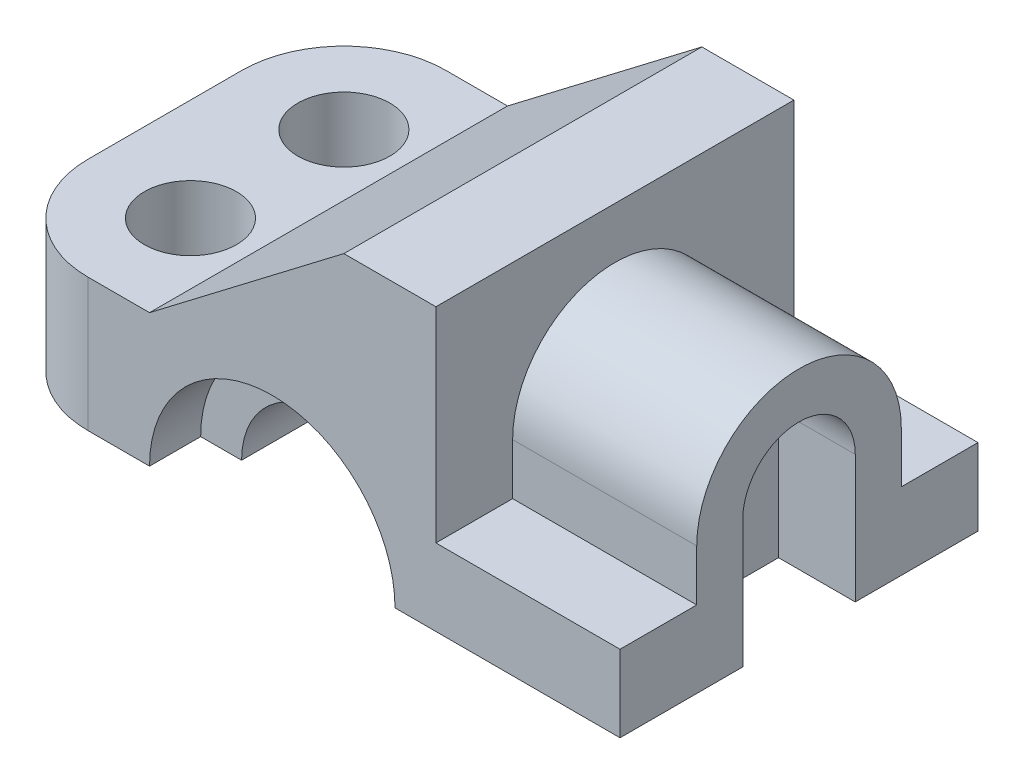
ISO-10303-21;
HEADER;
FILE_DESCRIPTION(('STEP AP214'),'2;1');
FILE_NAME('part.step','',(''),(''),'','','');
FILE_SCHEMA(('AUTOMOTIVE_DESIGN { 1 0 10303 214 1 1 1 1 }'));
ENDSEC;
DATA;
#1=APPLICATION_CONTEXT('core data for automotive mechanical design processes');
#2=APPLICATION_PROTOCOL_DEFINITION('international standard','automotive_design',2000,#1);
#3=PRODUCT_CONTEXT('',#1,'mechanical');
#4=PRODUCT('Part','Part','',(#3));
#5=PRODUCT_RELATED_PRODUCT_CATEGORY('part','',(#4));
#6=PRODUCT_DEFINITION_FORMATION('','',#4);
#7=PRODUCT_DEFINITION_CONTEXT('part definition',#1,'design');
#8=PRODUCT_DEFINITION('design','',#6,#7);
#9=PRODUCT_DEFINITION_SHAPE('','',#8);
#10=(LENGTH_UNIT() NAMED_UNIT(*) SI_UNIT(.MILLI.,.METRE.));
#11=(NAMED_UNIT(*) PLANE_ANGLE_UNIT() SI_UNIT($,.RADIAN.));
#12=(NAMED_UNIT(*) SI_UNIT($,.STERADIAN.) SOLID_ANGLE_UNIT());
#13=UNCERTAINTY_MEASURE_WITH_UNIT(LENGTH_MEASURE(1.E-05),#10,'distance_accuracy_value','');
#14=(GEOMETRIC_REPRESENTATION_CONTEXT(3) GLOBAL_UNCERTAINTY_ASSIGNED_CONTEXT((#13)) GLOBAL_UNIT_ASSIGNED_CONTEXT((#10,
#11,#12)) REPRESENTATION_CONTEXT('',''));
#15=CARTESIAN_POINT('',(0.,0.,0.));
#16=DIRECTION('',(0.,0.,1.));
#17=DIRECTION('',(1.,0.,0.));
#18=AXIS2_PLACEMENT_3D('',#15,#16,#17);
#19=CARTESIAN_POINT('',(88.,15.,-70.));
#20=DIRECTION('',(0.,1.,0.));
#21=DIRECTION('',(0.,0.,1.));
#22=AXIS2_PLACEMENT_3D('',#19,#20,#21);
#23=PLANE('',#22);
#24=DIRECTION('',(0.,0.,1.));
#25=VECTOR('',#24,1.);
#26=CARTESIAN_POINT('',(88.,15.,-70.));
#27=LINE('',#26,#25);
#28=CARTESIAN_POINT('',(88.,15.,-70.));
#29=VERTEX_POINT('',#28);
#30=CARTESIAN_POINT('',(88.,15.,-55.));
#31=VERTEX_POINT('',#30);
#32=EDGE_CURVE('E354',#29,#31,#27,.T.);
#33=ORIENTED_EDGE('',*,*,#32,.T.);
#34=DIRECTION('',(-1.,0.,0.));
#35=VECTOR('',#34,1.);
#36=CARTESIAN_POINT('',(124.,15.,-55.));
#37=LINE('',#36,#35);
#38=CARTESIAN_POINT('',(124.,15.,-55.));
#39=VERTEX_POINT('',#38);
#40=EDGE_CURVE('E241',#39,#31,#37,.T.);
#41=ORIENTED_EDGE('',*,*,#40,.F.);
#42=DIRECTION('',(0.,0.,1.));
#43=VECTOR('',#42,1.);
#44=CARTESIAN_POINT('',(124.,15.,-70.));
#45=LINE('',#44,#43);
#46=CARTESIAN_POINT('',(124.,15.,-70.));
#47=VERTEX_POINT('',#46);
#48=EDGE_CURVE('E358',#47,#39,#45,.T.);
#49=ORIENTED_EDGE('',*,*,#48,.F.);
#50=DIRECTION('',(-1.,0.,0.));
#51=VECTOR('',#50,1.);
#52=CARTESIAN_POINT('',(88.,15.,-70.));
#53=LINE('',#52,#51);
#54=EDGE_CURVE('E304',#47,#29,#53,.T.);
#55=ORIENTED_EDGE('',*,*,#54,.T.);
#56=EDGE_LOOP('',(#33,#41,#49,#55));
#57=FACE_BOUND('',#56,.T.);
#58=ADVANCED_FACE('F34',(#57),#23,.T.);
#59=CARTESIAN_POINT('',(56.,0.,-70.));
#60=DIRECTION('',(0.,0.,1.));
#61=DIRECTION('',(1.,0.,0.));
#62=AXIS2_PLACEMENT_3D('',#59,#60,#61);
#63=CYLINDRICAL_SURFACE('',#62,16.);
#64=CARTESIAN_POINT('',(56.,0.,-60.));
#65=DIRECTION('',(0.,0.,-1.));
#66=DIRECTION('',(-1.,0.,0.));
#67=AXIS2_PLACEMENT_3D('',#64,#65,#66);
#68=CIRCLE('',#67,16.);
#69=CARTESIAN_POINT('',(72.,0.,-60.));
#70=VERTEX_POINT('',#69);
#71=CARTESIAN_POINT('',(40.,0.,-60.));
#72=VERTEX_POINT('',#71);
#73=EDGE_CURVE('E11',#70,#72,#68,.F.);
#74=ORIENTED_EDGE('',*,*,#73,.F.);
#75=DIRECTION('',(0.,0.,1.));
#76=VECTOR('',#75,1.);
#77=CARTESIAN_POINT('',(72.,0.,-70.));
#78=LINE('',#77,#76);
#79=CARTESIAN_POINT('',(72.,0.,-10.));
#80=VERTEX_POINT('',#79);
#81=EDGE_CURVE('E263',#70,#80,#78,.T.);
#82=ORIENTED_EDGE('',*,*,#81,.T.);
#83=CARTESIAN_POINT('',(56.,0.,-10.));
#84=DIRECTION('',(0.,0.,1.));
#85=DIRECTION('',(1.,0.,0.));
#86=AXIS2_PLACEMENT_3D('',#83,#84,#85);
#87=CIRCLE('',#86,16.);
#88=CARTESIAN_POINT('',(40.,0.,-10.));
#89=VERTEX_POINT('',#88);
#90=EDGE_CURVE('E268',#80,#89,#87,.T.);
#91=ORIENTED_EDGE('',*,*,#90,.T.);
#92=DIRECTION('',(0.,0.,1.));
#93=VECTOR('',#92,1.);
#94=CARTESIAN_POINT('',(40.,0.,-70.));
#95=LINE('',#94,#93);
#96=EDGE_CURVE('E264',#72,#89,#95,.T.);
#97=ORIENTED_EDGE('',*,*,#96,.F.);
#98=EDGE_LOOP('',(#74,#82,#91,#97));
#99=FACE_BOUND('',#98,.T.);
#100=ADVANCED_FACE('F454',(#99),#63,.F.);
#101=CARTESIAN_POINT('',(124.,0.,-70.));
#102=DIRECTION('',(0.,-1.,0.));
#103=DIRECTION('',(0.,0.,-1.));
#104=AXIS2_PLACEMENT_3D('',#101,#102,#103);
#105=PLANE('',#104);
#106=DIRECTION('',(1.,0.,0.));
#107=VECTOR('',#106,1.);
#108=CARTESIAN_POINT('',(109.,0.,-24.));
#109=LINE('',#108,#107);
#110=CARTESIAN_POINT('',(109.,0.,-24.));
#111=VERTEX_POINT('',#110);
#112=CARTESIAN_POINT('',(124.,0.,-24.));
#113=VERTEX_POINT('',#112);
#114=EDGE_CURVE('E235',#111,#113,#109,.T.);
#115=ORIENTED_EDGE('',*,*,#114,.T.);
#116=DIRECTION('',(0.,0.,1.));
#117=VECTOR('',#116,1.);
#118=CARTESIAN_POINT('',(124.,0.,-70.));
#119=LINE('',#118,#117);
#120=CARTESIAN_POINT('',(124.,0.,0.));
#121=VERTEX_POINT('',#120);
#122=EDGE_CURVE('E319',#113,#121,#119,.T.);
#123=ORIENTED_EDGE('',*,*,#122,.T.);
#124=DIRECTION('',(1.,0.,0.));
#125=VECTOR('',#124,1.);
#126=CARTESIAN_POINT('',(124.,0.,0.));
#127=LINE('',#126,#125);
#128=CARTESIAN_POINT('',(80.,0.,0.));
#129=VERTEX_POINT('',#128);
#130=EDGE_CURVE('E294',#129,#121,#127,.T.);
#131=ORIENTED_EDGE('',*,*,#130,.F.);
#132=DIRECTION('',(0.,0.,1.));
#133=VECTOR('',#132,1.);
#134=CARTESIAN_POINT('',(80.,0.,-10.));
#135=LINE('',#134,#133);
#136=CARTESIAN_POINT('',(80.,0.,-10.));
#137=VERTEX_POINT('',#136);
#138=EDGE_CURVE('E283',#137,#129,#135,.T.);
#139=ORIENTED_EDGE('',*,*,#138,.F.);
#140=DIRECTION('',(1.,0.,0.));
#141=VECTOR('',#140,1.);
#142=CARTESIAN_POINT('',(0.,0.,-10.));
#143=LINE('',#142,#141);
#144=EDGE_CURVE('E271',#80,#137,#143,.T.);
#145=ORIENTED_EDGE('',*,*,#144,.F.);
#146=ORIENTED_EDGE('',*,*,#81,.F.);
#147=DIRECTION('',(1.,0.,0.));
#148=VECTOR('',#147,1.);
#149=CARTESIAN_POINT('',(124.,0.,-60.));
#150=LINE('',#149,#148);
#151=CARTESIAN_POINT('',(80.,0.,-60.));
#152=VERTEX_POINT('',#151);
#153=EDGE_CURVE('E256',#70,#152,#150,.T.);
#154=ORIENTED_EDGE('',*,*,#153,.T.);
#155=DIRECTION('',(0.,0.,-1.));
#156=VECTOR('',#155,1.);
#157=CARTESIAN_POINT('',(80.,0.,-60.));
#158=LINE('',#157,#156);
#159=CARTESIAN_POINT('',(80.,0.,-70.));
#160=VERTEX_POINT('',#159);
#161=EDGE_CURVE('E261',#160,#152,#158,.F.);
#162=ORIENTED_EDGE('',*,*,#161,.F.);
#163=DIRECTION('',(1.,0.,0.));
#164=VECTOR('',#163,1.);
#165=CARTESIAN_POINT('',(30.6974267968057,0.,-70.));
#166=LINE('',#165,#164);
#167=CARTESIAN_POINT('',(124.,0.,-70.));
#168=VERTEX_POINT('',#167);
#169=EDGE_CURVE('E301',#160,#168,#166,.T.);
#170=ORIENTED_EDGE('',*,*,#169,.T.);
#171=CARTESIAN_POINT('',(124.,0.,-46.));
#172=VERTEX_POINT('',#171);
#173=EDGE_CURVE('E216',#168,#172,#119,.T.);
#174=ORIENTED_EDGE('',*,*,#173,.T.);
#175=DIRECTION('',(1.,0.,0.));
#176=VECTOR('',#175,1.);
#177=CARTESIAN_POINT('',(109.,0.,-46.));
#178=LINE('',#177,#176);
#179=CARTESIAN_POINT('',(109.,0.,-46.));
#180=VERTEX_POINT('',#179);
#181=EDGE_CURVE('E49',#180,#172,#178,.T.);
#182=ORIENTED_EDGE('',*,*,#181,.F.);
#183=DIRECTION('',(0.,0.,-1.));
#184=VECTOR('',#183,1.);
#185=CARTESIAN_POINT('',(109.,0.,-46.));
#186=LINE('',#185,#184);
#187=EDGE_CURVE('E202',#111,#180,#186,.T.);
#188=ORIENTED_EDGE('',*,*,#187,.F.);
#189=EDGE_LOOP('',(#115,#123,#131,#139,#145,#146,#154,#162,#170,#174,#182,#188));
#190=FACE_BOUND('',#189,.T.);
#191=ADVANCED_FACE('F214',(#190),#105,.T.);
#192=DIRECTION('',(0.,0.,-1.));
#193=VECTOR('',#192,1.);
#194=CARTESIAN_POINT('',(32.,0.,-60.));
#195=LINE('',#194,#193);
#196=CARTESIAN_POINT('',(32.,0.,-60.));
#197=VERTEX_POINT('',#196);
#198=CARTESIAN_POINT('',(32.,0.,-70.));
#199=VERTEX_POINT('',#198);
#200=EDGE_CURVE('E259',#197,#199,#195,.T.);
#201=ORIENTED_EDGE('',*,*,#200,.F.);
#202=DIRECTION('',(1.,0.,0.));
#203=VECTOR('',#202,1.);
#204=CARTESIAN_POINT('',(124.,0.,-60.));
#205=LINE('',#204,#203);
#206=EDGE_CURVE('E252',#197,#72,#205,.T.);
#207=ORIENTED_EDGE('',*,*,#206,.T.);
#208=ORIENTED_EDGE('',*,*,#96,.T.);
#209=CARTESIAN_POINT('',(32.,0.,-10.));
#210=VERTEX_POINT('',#209);
#211=EDGE_CURVE('E275',#210,#89,#143,.T.);
#212=ORIENTED_EDGE('',*,*,#211,.F.);
#213=DIRECTION('',(0.,0.,1.));
#214=VECTOR('',#213,1.);
#215=CARTESIAN_POINT('',(32.,0.,-10.));
#216=LINE('',#215,#214);
#217=CARTESIAN_POINT('',(32.,0.,0.));
#218=VERTEX_POINT('',#217);
#219=EDGE_CURVE('E279',#210,#218,#216,.T.);
#220=ORIENTED_EDGE('',*,*,#219,.T.);
#221=CARTESIAN_POINT('',(20.,0.,0.));
#222=VERTEX_POINT('',#221);
#223=EDGE_CURVE('E320',#222,#218,#127,.T.);
#224=ORIENTED_EDGE('',*,*,#223,.F.);
#225=CARTESIAN_POINT('',(20.,0.,-20.));
#226=DIRECTION('',(0.,-1.,0.));
#227=DIRECTION('',(0.,0.,-1.));
#228=AXIS2_PLACEMENT_3D('',#225,#226,#227);
#229=CIRCLE('',#228,20.);
#230=CARTESIAN_POINT('',(0.,0.,-20.));
#231=VERTEX_POINT('',#230);
#232=EDGE_CURVE('E367',#222,#231,#229,.T.);
#233=ORIENTED_EDGE('',*,*,#232,.T.);
#234=DIRECTION('',(0.,0.,1.));
#235=VECTOR('',#234,1.);
#236=CARTESIAN_POINT('',(0.,0.,-70.));
#237=LINE('',#236,#235);
#238=CARTESIAN_POINT('',(0.,0.,-50.));
#239=VERTEX_POINT('',#238);
#240=EDGE_CURVE('E341',#239,#231,#237,.T.);
#241=ORIENTED_EDGE('',*,*,#240,.F.);
#242=CARTESIAN_POINT('',(20.,0.,-50.));
#243=DIRECTION('',(0.,-1.,0.));
#244=DIRECTION('',(0.,0.,-1.));
#245=AXIS2_PLACEMENT_3D('',#242,#243,#244);
#246=CIRCLE('',#245,20.);
#247=CARTESIAN_POINT('',(20.,0.,-70.));
#248=VERTEX_POINT('',#247);
#249=EDGE_CURVE('E369',#239,#248,#246,.T.);
#250=ORIENTED_EDGE('',*,*,#249,.T.);
#251=EDGE_CURVE('E297',#248,#199,#166,.T.);
#252=ORIENTED_EDGE('',*,*,#251,.T.);
#253=EDGE_LOOP('',(#201,#207,#208,#212,#220,#224,#233,#241,#250,#252));
#254=FACE_BOUND('',#253,.T.);
#255=CARTESIAN_POINT('',(20.,0.,-50.));
#256=DIRECTION('',(0.,1.,0.));
#257=DIRECTION('',(0.,0.,-1.));
#258=AXIS2_PLACEMENT_3D('',#255,#256,#257);
#259=CIRCLE('',#258,9.);
#260=CARTESIAN_POINT('',(20.,0.,-41.));
#261=VERTEX_POINT('',#260);
#262=EDGE_CURVE('E285',#261,#261,#259,.T.);
#263=ORIENTED_EDGE('',*,*,#262,.T.);
#264=EDGE_LOOP('',(#263));
#265=FACE_BOUND('',#264,.T.);
#266=CARTESIAN_POINT('',(20.,0.,-20.));
#267=DIRECTION('',(0.,1.,0.));
#268=DIRECTION('',(0.,0.,1.));
#269=AXIS2_PLACEMENT_3D('',#266,#267,#268);
#270=CIRCLE('',#269,9.);
#271=CARTESIAN_POINT('',(20.,0.,-11.));
#272=VERTEX_POINT('',#271);
#273=EDGE_CURVE('E291',#272,#272,#270,.T.);
#274=ORIENTED_EDGE('',*,*,#273,.T.);
#275=EDGE_LOOP('',(#274));
#276=FACE_BOUND('',#275,.T.);
#277=ADVANCED_FACE('F387',(#254,#265,#276),#105,.T.);
#278=CARTESIAN_POINT('',(0.,0.,-70.));
#279=DIRECTION('',(-1.,0.,0.));
#280=DIRECTION('',(0.,0.,1.));
#281=AXIS2_PLACEMENT_3D('',#278,#279,#280);
#282=PLANE('',#281);
#283=DIRECTION('',(0.,0.,1.));
#284=VECTOR('',#283,1.);
#285=CARTESIAN_POINT('',(0.,26.,-70.));
#286=LINE('',#285,#284);
#287=CARTESIAN_POINT('',(0.,26.,-50.));
#288=VERTEX_POINT('',#287);
#289=CARTESIAN_POINT('',(0.,26.,-20.));
#290=VERTEX_POINT('',#289);
#291=EDGE_CURVE('E345',#288,#290,#286,.T.);
#292=ORIENTED_EDGE('',*,*,#291,.F.);
#293=DIRECTION('',(0.,-1.,0.));
#294=VECTOR('',#293,1.);
#295=CARTESIAN_POINT('',(0.,0.,-50.));
#296=LINE('',#295,#294);
#297=EDGE_CURVE('E364',#288,#239,#296,.T.);
#298=ORIENTED_EDGE('',*,*,#297,.T.);
#299=ORIENTED_EDGE('',*,*,#240,.T.);
#300=DIRECTION('',(0.,-1.,0.));
#301=VECTOR('',#300,1.);
#302=CARTESIAN_POINT('',(0.,26.,-20.));
#303=LINE('',#302,#301);
#304=EDGE_CURVE('E344',#231,#290,#303,.F.);
#305=ORIENTED_EDGE('',*,*,#304,.T.);
#306=EDGE_LOOP('',(#292,#298,#299,#305));
#307=FACE_BOUND('',#306,.T.);
#308=ADVANCED_FACE('F429',(#307),#282,.T.);
#309=CARTESIAN_POINT('',(0.,26.,-70.));
#310=DIRECTION('',(0.,1.,0.));
#311=DIRECTION('',(0.,0.,1.));
#312=AXIS2_PLACEMENT_3D('',#309,#310,#311);
#313=PLANE('',#312);
#314=CARTESIAN_POINT('',(20.,26.,-50.));
#315=DIRECTION('',(0.,1.,0.));
#316=DIRECTION('',(0.,0.,-1.));
#317=AXIS2_PLACEMENT_3D('',#314,#315,#316);
#318=CIRCLE('',#317,9.);
#319=CARTESIAN_POINT('',(20.,26.,-41.));
#320=VERTEX_POINT('',#319);
#321=EDGE_CURVE('E282',#320,#320,#318,.T.);
#322=ORIENTED_EDGE('',*,*,#321,.F.);
#323=EDGE_LOOP('',(#322));
#324=FACE_BOUND('',#323,.T.);
#325=CARTESIAN_POINT('',(20.,26.,-20.));
#326=DIRECTION('',(0.,1.,0.));
#327=DIRECTION('',(0.,0.,1.));
#328=AXIS2_PLACEMENT_3D('',#325,#326,#327);
#329=CIRCLE('',#328,9.);
#330=CARTESIAN_POINT('',(20.,26.,-11.));
#331=VERTEX_POINT('',#330);
#332=EDGE_CURVE('E288',#331,#331,#329,.T.);
#333=ORIENTED_EDGE('',*,*,#332,.F.);
#334=EDGE_LOOP('',(#333));
#335=FACE_BOUND('',#334,.T.);
#336=DIRECTION('',(-1.,0.,0.));
#337=VECTOR('',#336,1.);
#338=CARTESIAN_POINT('',(0.,26.,-70.));
#339=LINE('',#338,#337);
#340=CARTESIAN_POINT('',(32.,26.,-70.));
#341=VERTEX_POINT('',#340);
#342=CARTESIAN_POINT('',(20.,26.,-70.));
#343=VERTEX_POINT('',#342);
#344=EDGE_CURVE('E316',#341,#343,#339,.T.);
#345=ORIENTED_EDGE('',*,*,#344,.T.);
#346=CARTESIAN_POINT('',(20.,26.,-50.));
#347=DIRECTION('',(0.,1.,0.));
#348=DIRECTION('',(0.,0.,1.));
#349=AXIS2_PLACEMENT_3D('',#346,#347,#348);
#350=CIRCLE('',#349,20.);
#351=EDGE_CURVE('E375',#343,#288,#350,.T.);
#352=ORIENTED_EDGE('',*,*,#351,.T.);
#353=ORIENTED_EDGE('',*,*,#291,.T.);
#354=CARTESIAN_POINT('',(20.,26.,-20.));
#355=DIRECTION('',(0.,1.,0.));
#356=DIRECTION('',(0.,0.,1.));
#357=AXIS2_PLACEMENT_3D('',#354,#355,#356);
#358=CIRCLE('',#357,20.);
#359=CARTESIAN_POINT('',(20.,26.,0.));
#360=VERTEX_POINT('',#359);
#361=EDGE_CURVE('E373',#290,#360,#358,.T.);
#362=ORIENTED_EDGE('',*,*,#361,.T.);
#363=DIRECTION('',(-1.,0.,0.));
#364=VECTOR('',#363,1.);
#365=CARTESIAN_POINT('',(0.,26.,0.));
#366=LINE('',#365,#364);
#367=CARTESIAN_POINT('',(32.,26.,0.));
#368=VERTEX_POINT('',#367);
#369=EDGE_CURVE('E338',#368,#360,#366,.T.);
#370=ORIENTED_EDGE('',*,*,#369,.F.);
#371=DIRECTION('',(0.,0.,1.));
#372=VECTOR('',#371,1.);
#373=CARTESIAN_POINT('',(32.,26.,-70.));
#374=LINE('',#373,#372);
#375=EDGE_CURVE('E348',#341,#368,#374,.T.);
#376=ORIENTED_EDGE('',*,*,#375,.F.);
#377=EDGE_LOOP('',(#345,#352,#353,#362,#370,#376));
#378=FACE_BOUND('',#377,.T.);
#379=ADVANCED_FACE('F425',(#324,#335,#378),#313,.T.);
#380=CARTESIAN_POINT('',(32.,26.,-70.));
#381=DIRECTION('',(-0.606673319350191,0.794951246045078,0.));
#382=DIRECTION('',(-0.794951246045078,-0.606673319350191,0.));
#383=AXIS2_PLACEMENT_3D('',#380,#381,#382);
#384=PLANE('',#383);
#385=DIRECTION('',(-0.794951246045078,-0.606673319350191,0.));
#386=VECTOR('',#385,1.);
#387=CARTESIAN_POINT('',(32.,26.,0.));
#388=LINE('',#387,#386);
#389=CARTESIAN_POINT('',(70.,55.,0.));
#390=VERTEX_POINT('',#389);
#391=EDGE_CURVE('E335',#390,#368,#388,.T.);
#392=ORIENTED_EDGE('',*,*,#391,.F.);
#393=DIRECTION('',(0.,0.,1.));
#394=VECTOR('',#393,1.);
#395=CARTESIAN_POINT('',(70.,55.,-70.));
#396=LINE('',#395,#394);
#397=CARTESIAN_POINT('',(70.,55.,-70.));
#398=VERTEX_POINT('',#397);
#399=EDGE_CURVE('E350',#398,#390,#396,.T.);
#400=ORIENTED_EDGE('',*,*,#399,.F.);
#401=DIRECTION('',(-0.794951246045078,-0.606673319350191,0.));
#402=VECTOR('',#401,1.);
#403=CARTESIAN_POINT('',(32.,26.,-70.));
#404=LINE('',#403,#402);
#405=EDGE_CURVE('E313',#398,#341,#404,.T.);
#406=ORIENTED_EDGE('',*,*,#405,.T.);
#407=ORIENTED_EDGE('',*,*,#375,.T.);
#408=EDGE_LOOP('',(#392,#400,#406,#407));
#409=FACE_BOUND('',#408,.T.);
#410=ADVANCED_FACE('F422',(#409),#384,.T.);
#411=CARTESIAN_POINT('',(70.,55.,-70.));
#412=DIRECTION('',(0.,1.,0.));
#413=DIRECTION('',(-1.,0.,0.));
#414=AXIS2_PLACEMENT_3D('',#411,#412,#413);
#415=PLANE('',#414);
#416=DIRECTION('',(-1.,0.,0.));
#417=VECTOR('',#416,1.);
#418=CARTESIAN_POINT('',(70.,55.,0.));
#419=LINE('',#418,#417);
#420=CARTESIAN_POINT('',(88.,55.,0.));
#421=VERTEX_POINT('',#420);
#422=EDGE_CURVE('E332',#421,#390,#419,.T.);
#423=ORIENTED_EDGE('',*,*,#422,.F.);
#424=DIRECTION('',(0.,0.,1.));
#425=VECTOR('',#424,1.);
#426=CARTESIAN_POINT('',(88.,55.,-70.));
#427=LINE('',#426,#425);
#428=CARTESIAN_POINT('',(88.,55.,-70.));
#429=VERTEX_POINT('',#428);
#430=EDGE_CURVE('E352',#429,#421,#427,.T.);
#431=ORIENTED_EDGE('',*,*,#430,.F.);
#432=DIRECTION('',(-1.,0.,0.));
#433=VECTOR('',#432,1.);
#434=CARTESIAN_POINT('',(70.,55.,-70.));
#435=LINE('',#434,#433);
#436=EDGE_CURVE('E310',#429,#398,#435,.T.);
#437=ORIENTED_EDGE('',*,*,#436,.T.);
#438=ORIENTED_EDGE('',*,*,#399,.T.);
#439=EDGE_LOOP('',(#423,#431,#437,#438));
#440=FACE_BOUND('',#439,.T.);
#441=ADVANCED_FACE('F418',(#440),#415,.T.);
#442=CARTESIAN_POINT('',(88.,55.,-70.));
#443=DIRECTION('',(1.,0.,0.));
#444=DIRECTION('',(0.,1.,0.));
#445=AXIS2_PLACEMENT_3D('',#442,#443,#444);
#446=PLANE('',#445);
#447=DIRECTION('',(0.,1.,0.));
#448=VECTOR('',#447,1.);
#449=CARTESIAN_POINT('',(88.,0.,-15.));
#450=LINE('',#449,#448);
#451=CARTESIAN_POINT('',(88.,15.,-15.));
#452=VERTEX_POINT('',#451);
#453=CARTESIAN_POINT('',(88.,25.,-15.));
#454=VERTEX_POINT('',#453);
#455=EDGE_CURVE('E234',#452,#454,#450,.T.);
#456=ORIENTED_EDGE('',*,*,#455,.T.);
#457=CARTESIAN_POINT('',(88.,25.,-35.));
#458=DIRECTION('',(1.,0.,0.));
#459=DIRECTION('',(0.,1.,0.));
#460=AXIS2_PLACEMENT_3D('',#457,#458,#459);
#461=CIRCLE('',#460,20.);
#462=CARTESIAN_POINT('',(88.,25.,-55.));
#463=VERTEX_POINT('',#462);
#464=EDGE_CURVE('E231',#454,#463,#461,.F.);
#465=ORIENTED_EDGE('',*,*,#464,.T.);
#466=DIRECTION('',(0.,1.,0.));
#467=VECTOR('',#466,1.);
#468=CARTESIAN_POINT('',(88.,0.,-55.));
#469=LINE('',#468,#467);
#470=EDGE_CURVE('E226',#31,#463,#469,.T.);
#471=ORIENTED_EDGE('',*,*,#470,.F.);
#472=ORIENTED_EDGE('',*,*,#32,.F.);
#473=DIRECTION('',(0.,1.,0.));
#474=VECTOR('',#473,1.);
#475=CARTESIAN_POINT('',(88.,55.,-70.));
#476=LINE('',#475,#474);
#477=EDGE_CURVE('E307',#29,#429,#476,.T.);
#478=ORIENTED_EDGE('',*,*,#477,.T.);
#479=ORIENTED_EDGE('',*,*,#430,.T.);
#480=DIRECTION('',(0.,1.,0.));
#481=VECTOR('',#480,1.);
#482=CARTESIAN_POINT('',(88.,55.,0.));
#483=LINE('',#482,#481);
#484=CARTESIAN_POINT('',(88.,15.,0.));
#485=VERTEX_POINT('',#484);
#486=EDGE_CURVE('E329',#485,#421,#483,.T.);
#487=ORIENTED_EDGE('',*,*,#486,.F.);
#488=EDGE_CURVE('E357',#452,#485,#27,.T.);
#489=ORIENTED_EDGE('',*,*,#488,.F.);
#490=EDGE_LOOP('',(#456,#465,#471,#472,#478,#479,#487,#489));
#491=FACE_BOUND('',#490,.T.);
#492=ADVANCED_FACE('F414',(#491),#446,.T.);
#493=DIRECTION('',(-1.,0.,0.));
#494=VECTOR('',#493,1.);
#495=CARTESIAN_POINT('',(124.,15.,-15.));
#496=LINE('',#495,#494);
#497=CARTESIAN_POINT('',(124.,15.,-15.));
#498=VERTEX_POINT('',#497);
#499=EDGE_CURVE('E243',#498,#452,#496,.T.);
#500=ORIENTED_EDGE('',*,*,#499,.T.);
#501=ORIENTED_EDGE('',*,*,#488,.T.);
#502=DIRECTION('',(-1.,0.,0.));
#503=VECTOR('',#502,1.);
#504=CARTESIAN_POINT('',(88.,15.,0.));
#505=LINE('',#504,#503);
#506=CARTESIAN_POINT('',(124.,15.,0.));
#507=VERTEX_POINT('',#506);
#508=EDGE_CURVE('E326',#507,#485,#505,.T.);
#509=ORIENTED_EDGE('',*,*,#508,.F.);
#510=EDGE_CURVE('E361',#498,#507,#45,.T.);
#511=ORIENTED_EDGE('',*,*,#510,.F.);
#512=EDGE_LOOP('',(#500,#501,#509,#511));
#513=FACE_BOUND('',#512,.T.);
#514=ADVANCED_FACE('F409',(#513),#23,.T.);
#515=CARTESIAN_POINT('',(124.,15.,-70.));
#516=DIRECTION('',(1.,0.,0.));
#517=DIRECTION('',(0.,0.,-1.));
#518=AXIS2_PLACEMENT_3D('',#515,#516,#517);
#519=PLANE('',#518);
#520=DIRECTION('',(0.,-1.,0.));
#521=VECTOR('',#520,1.);
#522=CARTESIAN_POINT('',(124.,0.,-24.));
#523=LINE('',#522,#521);
#524=CARTESIAN_POINT('',(124.,25.,-24.));
#525=VERTEX_POINT('',#524);
#526=EDGE_CURVE('E211',#525,#113,#523,.T.);
#527=ORIENTED_EDGE('',*,*,#526,.F.);
#528=CARTESIAN_POINT('',(124.,25.,-35.));
#529=DIRECTION('',(1.,0.,0.));
#530=DIRECTION('',(0.,0.,1.));
#531=AXIS2_PLACEMENT_3D('',#528,#529,#530);
#532=CIRCLE('',#531,11.);
#533=CARTESIAN_POINT('',(124.,25.,-46.));
#534=VERTEX_POINT('',#533);
#535=EDGE_CURVE('E704',#534,#525,#532,.T.);
#536=ORIENTED_EDGE('',*,*,#535,.F.);
#537=DIRECTION('',(0.,1.,0.));
#538=VECTOR('',#537,1.);
#539=CARTESIAN_POINT('',(124.,25.,-46.));
#540=LINE('',#539,#538);
#541=EDGE_CURVE('E705',#172,#534,#540,.T.);
#542=ORIENTED_EDGE('',*,*,#541,.F.);
#543=ORIENTED_EDGE('',*,*,#173,.F.);
#544=DIRECTION('',(0.,1.,0.));
#545=VECTOR('',#544,1.);
#546=CARTESIAN_POINT('',(124.,15.,-70.));
#547=LINE('',#546,#545);
#548=EDGE_CURVE('E300',#168,#47,#547,.T.);
#549=ORIENTED_EDGE('',*,*,#548,.T.);
#550=ORIENTED_EDGE('',*,*,#48,.T.);
#551=DIRECTION('',(0.,1.,0.));
#552=VECTOR('',#551,1.);
#553=CARTESIAN_POINT('',(124.,0.,-55.));
#554=LINE('',#553,#552);
#555=CARTESIAN_POINT('',(124.,25.,-55.));
#556=VERTEX_POINT('',#555);
#557=EDGE_CURVE('E228',#39,#556,#554,.T.);
#558=ORIENTED_EDGE('',*,*,#557,.T.);
#559=CARTESIAN_POINT('',(124.,25.,-35.));
#560=DIRECTION('',(1.,0.,0.));
#561=DIRECTION('',(0.,1.,0.));
#562=AXIS2_PLACEMENT_3D('',#559,#560,#561);
#563=CIRCLE('',#562,20.);
#564=CARTESIAN_POINT('',(124.,25.,-15.));
#565=VERTEX_POINT('',#564);
#566=EDGE_CURVE('E223',#565,#556,#563,.F.);
#567=ORIENTED_EDGE('',*,*,#566,.F.);
#568=DIRECTION('',(0.,1.,0.));
#569=VECTOR('',#568,1.);
#570=CARTESIAN_POINT('',(124.,0.,-15.));
#571=LINE('',#570,#569);
#572=EDGE_CURVE('E57',#498,#565,#571,.T.);
#573=ORIENTED_EDGE('',*,*,#572,.F.);
#574=ORIENTED_EDGE('',*,*,#510,.T.);
#575=DIRECTION('',(0.,1.,0.));
#576=VECTOR('',#575,1.);
#577=CARTESIAN_POINT('',(124.,15.,0.));
#578=LINE('',#577,#576);
#579=EDGE_CURVE('E323',#121,#507,#578,.T.);
#580=ORIENTED_EDGE('',*,*,#579,.F.);
#581=ORIENTED_EDGE('',*,*,#122,.F.);
#582=EDGE_LOOP('',(#527,#536,#542,#543,#549,#550,#558,#567,#573,#574,#580,#581));
#583=FACE_BOUND('',#582,.T.);
#584=ADVANCED_FACE('F405',(#583),#519,.T.);
#585=CARTESIAN_POINT('',(0.,0.,-70.));
#586=DIRECTION('',(0.,0.,-1.));
#587=DIRECTION('',(-1.,0.,0.));
#588=AXIS2_PLACEMENT_3D('',#585,#586,#587);
#589=PLANE('',#588);
#590=CARTESIAN_POINT('',(56.,0.,-70.));
#591=DIRECTION('',(0.,0.,-1.));
#592=DIRECTION('',(-1.,0.,0.));
#593=AXIS2_PLACEMENT_3D('',#590,#591,#592);
#594=CIRCLE('',#593,24.);
#595=EDGE_CURVE('E248',#199,#160,#594,.T.);
#596=ORIENTED_EDGE('',*,*,#595,.F.);
#597=ORIENTED_EDGE('',*,*,#251,.F.);
#598=DIRECTION('',(0.,-1.,0.));
#599=VECTOR('',#598,1.);
#600=CARTESIAN_POINT('',(20.,0.,-70.));
#601=LINE('',#600,#599);
#602=EDGE_CURVE('E371',#248,#343,#601,.F.);
#603=ORIENTED_EDGE('',*,*,#602,.T.);
#604=ORIENTED_EDGE('',*,*,#344,.F.);
#605=ORIENTED_EDGE('',*,*,#405,.F.);
#606=ORIENTED_EDGE('',*,*,#436,.F.);
#607=ORIENTED_EDGE('',*,*,#477,.F.);
#608=ORIENTED_EDGE('',*,*,#54,.F.);
#609=ORIENTED_EDGE('',*,*,#548,.F.);
#610=ORIENTED_EDGE('',*,*,#169,.F.);
#611=EDGE_LOOP('',(#596,#597,#603,#604,#605,#606,#607,#608,#609,#610));
#612=FACE_BOUND('',#611,.T.);
#613=ADVANCED_FACE('F436',(#612),#589,.T.);
#614=CARTESIAN_POINT('',(0.,0.,0.));
#615=DIRECTION('',(0.,0.,-1.));
#616=DIRECTION('',(-1.,0.,0.));
#617=AXIS2_PLACEMENT_3D('',#614,#615,#616);
#618=PLANE('',#617);
#619=ORIENTED_EDGE('',*,*,#223,.T.);
#620=CARTESIAN_POINT('',(56.,0.,0.));
#621=DIRECTION('',(0.,0.,1.));
#622=DIRECTION('',(1.,0.,0.));
#623=AXIS2_PLACEMENT_3D('',#620,#621,#622);
#624=CIRCLE('',#623,24.);
#625=EDGE_CURVE('E266',#129,#218,#624,.T.);
#626=ORIENTED_EDGE('',*,*,#625,.F.);
#627=ORIENTED_EDGE('',*,*,#130,.T.);
#628=ORIENTED_EDGE('',*,*,#579,.T.);
#629=ORIENTED_EDGE('',*,*,#508,.T.);
#630=ORIENTED_EDGE('',*,*,#486,.T.);
#631=ORIENTED_EDGE('',*,*,#422,.T.);
#632=ORIENTED_EDGE('',*,*,#391,.T.);
#633=ORIENTED_EDGE('',*,*,#369,.T.);
#634=DIRECTION('',(0.,-1.,0.));
#635=VECTOR('',#634,1.);
#636=CARTESIAN_POINT('',(20.,0.,0.));
#637=LINE('',#636,#635);
#638=EDGE_CURVE('E42',#360,#222,#637,.T.);
#639=ORIENTED_EDGE('',*,*,#638,.T.);
#640=EDGE_LOOP('',(#619,#626,#627,#628,#629,#630,#631,#632,#633,#639));
#641=FACE_BOUND('',#640,.T.);
#642=ADVANCED_FACE('F380',(#641),#618,.F.);
#643=CARTESIAN_POINT('',(20.,0.,-50.));
#644=DIRECTION('',(0.,-1.,0.));
#645=DIRECTION('',(0.,0.,-1.));
#646=AXIS2_PLACEMENT_3D('',#643,#644,#645);
#647=CYLINDRICAL_SURFACE('',#646,20.);
#648=ORIENTED_EDGE('',*,*,#351,.F.);
#649=ORIENTED_EDGE('',*,*,#602,.F.);
#650=ORIENTED_EDGE('',*,*,#249,.F.);
#651=ORIENTED_EDGE('',*,*,#297,.F.);
#652=EDGE_LOOP('',(#648,#649,#650,#651));
#653=FACE_BOUND('',#652,.T.);
#654=ADVANCED_FACE('F439',(#653),#647,.T.);
#655=CARTESIAN_POINT('',(20.,0.,-20.));
#656=DIRECTION('',(0.,1.,0.));
#657=DIRECTION('',(0.,0.,1.));
#658=AXIS2_PLACEMENT_3D('',#655,#656,#657);
#659=CYLINDRICAL_SURFACE('',#658,20.);
#660=ORIENTED_EDGE('',*,*,#361,.F.);
#661=ORIENTED_EDGE('',*,*,#304,.F.);
#662=ORIENTED_EDGE('',*,*,#232,.F.);
#663=ORIENTED_EDGE('',*,*,#638,.F.);
#664=EDGE_LOOP('',(#660,#661,#662,#663));
#665=FACE_BOUND('',#664,.T.);
#666=ADVANCED_FACE('F36',(#665),#659,.T.);
#667=CARTESIAN_POINT('',(20.,0.,-20.));
#668=DIRECTION('',(0.,1.,0.));
#669=DIRECTION('',(0.,0.,1.));
#670=AXIS2_PLACEMENT_3D('',#667,#668,#669);
#671=CYLINDRICAL_SURFACE('',#670,9.);
#672=CARTESIAN_POINT('',(20.,0.,-11.));
#673=CARTESIAN_POINT('',(20.,0.270833333333333,-11.));
#674=CARTESIAN_POINT('',(20.,0.541666666666667,-11.));
#675=CARTESIAN_POINT('',(20.,1.08333333333333,-11.));
#676=CARTESIAN_POINT('',(20.,1.35416666666667,-11.));
#677=CARTESIAN_POINT('',(20.,1.89583333333333,-11.));
#678=CARTESIAN_POINT('',(20.,2.16666666666667,-11.));
#679=CARTESIAN_POINT('',(20.,2.70833333333333,-11.));
#680=CARTESIAN_POINT('',(20.,2.97916666666667,-11.));
#681=CARTESIAN_POINT('',(20.,3.52083333333333,-11.));
#682=CARTESIAN_POINT('',(20.,3.79166666666667,-11.));
#683=CARTESIAN_POINT('',(20.,4.33333333333333,-11.));
#684=CARTESIAN_POINT('',(20.,4.60416666666667,-11.));
#685=CARTESIAN_POINT('',(20.,5.14583333333333,-11.));
#686=CARTESIAN_POINT('',(20.,5.41666666666667,-11.));
#687=CARTESIAN_POINT('',(20.,5.95833333333333,-11.));
#688=CARTESIAN_POINT('',(20.,6.22916666666667,-11.));
#689=CARTESIAN_POINT('',(20.,6.77083333333333,-11.));
#690=CARTESIAN_POINT('',(20.,7.04166666666667,-11.));
#691=CARTESIAN_POINT('',(20.,7.58333333333333,-11.));
#692=CARTESIAN_POINT('',(20.,7.85416666666667,-11.));
#693=CARTESIAN_POINT('',(20.,8.39583333333333,-11.));
#694=CARTESIAN_POINT('',(20.,8.66666666666667,-11.));
#695=CARTESIAN_POINT('',(20.,9.20833333333333,-11.));
#696=CARTESIAN_POINT('',(20.,9.47916666666667,-11.));
#697=CARTESIAN_POINT('',(20.,10.0208333333333,-11.));
#698=CARTESIAN_POINT('',(20.,10.2916666666667,-11.));
#699=CARTESIAN_POINT('',(20.,10.8333333333333,-11.));
#700=CARTESIAN_POINT('',(20.,11.1041666666667,-11.));
#701=CARTESIAN_POINT('',(20.,11.6458333333333,-11.));
#702=CARTESIAN_POINT('',(20.,11.9166666666667,-11.));
#703=CARTESIAN_POINT('',(20.,12.4583333333333,-11.));
#704=CARTESIAN_POINT('',(20.,12.7291666666667,-11.));
#705=CARTESIAN_POINT('',(20.,13.2708333333333,-11.));
#706=CARTESIAN_POINT('',(20.,13.5416666666667,-11.));
#707=CARTESIAN_POINT('',(20.,14.0833333333333,-11.));
#708=CARTESIAN_POINT('',(20.,14.3541666666667,-11.));
#709=CARTESIAN_POINT('',(20.,14.8958333333333,-11.));
#710=CARTESIAN_POINT('',(20.,15.1666666666667,-11.));
#711=CARTESIAN_POINT('',(20.,15.7083333333333,-11.));
#712=CARTESIAN_POINT('',(20.,15.9791666666667,-11.));
#713=CARTESIAN_POINT('',(20.,16.5208333333333,-11.));
#714=CARTESIAN_POINT('',(20.,16.7916666666667,-11.));
#715=CARTESIAN_POINT('',(20.,17.3333333333333,-11.));
#716=CARTESIAN_POINT('',(20.,17.6041666666667,-11.));
#717=CARTESIAN_POINT('',(20.,18.1458333333333,-11.));
#718=CARTESIAN_POINT('',(20.,18.4166666666667,-11.));
#719=CARTESIAN_POINT('',(20.,18.9583333333333,-11.));
#720=CARTESIAN_POINT('',(20.,19.2291666666667,-11.));
#721=CARTESIAN_POINT('',(20.,19.7708333333333,-11.));
#722=CARTESIAN_POINT('',(20.,20.0416666666667,-11.));
#723=CARTESIAN_POINT('',(20.,20.5833333333333,-11.));
#724=CARTESIAN_POINT('',(20.,20.8541666666667,-11.));
#725=CARTESIAN_POINT('',(20.,21.3958333333333,-11.));
#726=CARTESIAN_POINT('',(20.,21.6666666666667,-11.));
#727=CARTESIAN_POINT('',(20.,22.2083333333333,-11.));
#728=CARTESIAN_POINT('',(20.,22.4791666666667,-11.));
#729=CARTESIAN_POINT('',(20.,23.0208333333333,-11.));
#730=CARTESIAN_POINT('',(20.,23.2916666666667,-11.));
#731=CARTESIAN_POINT('',(20.,23.8333333333333,-11.));
#732=CARTESIAN_POINT('',(20.,24.1041666666667,-11.));
#733=CARTESIAN_POINT('',(20.,24.6458333333333,-11.));
#734=CARTESIAN_POINT('',(20.,24.9166666666667,-11.));
#735=CARTESIAN_POINT('',(20.,25.4583333333333,-11.));
#736=CARTESIAN_POINT('',(20.,25.7291666666667,-11.));
#737=CARTESIAN_POINT('',(20.,26.,-11.));
#738=B_SPLINE_CURVE_WITH_KNOTS('',3,(#672,#673,#674,#675,#676,#677,#678,#679,#680,#681,#682,
#683,#684,#685,#686,#687,#688,#689,#690,#691,#692,#693,#694,#695,#696,#697,#698,#699,#700,#701,
#702,#703,#704,#705,#706,#707,#708,#709,#710,#711,#712,#713,#714,#715,#716,#717,#718,#719,#720,
#721,#722,#723,#724,#725,#726,#727,#728,#729,#730,#731,#732,#733,#734,#735,#736,#737),
.UNSPECIFIED.,.F.,.F.,(4,2,2,2,2,2,2,2,2,2,2,2,2,2,2,2,2,2,2,2,2,2,2,2,2,2,2,2,2,2,2,2,4),(0.,
0.8125,1.625,2.4375,3.25,4.0625,4.875,5.6875,6.5,7.3125,8.125,8.9375,9.75,10.5625,11.375,
12.1875,13.,13.8125,14.625,15.4375,16.25,17.0625,17.875,18.6875,19.5,20.3125,21.125,21.9375,
22.75,23.5625,24.375,25.1875,26.),.UNSPECIFIED.);
#739=EDGE_CURVE('BSEAM473',#272,#331,#738,.T.);
#740=ORIENTED_EDGE('',*,*,#273,.F.);
#741=ORIENTED_EDGE('',*,*,#332,.T.);
#742=ORIENTED_EDGE('',*,*,#739,.T.);
#743=ORIENTED_EDGE('',*,*,#739,.F.);
#744=EDGE_LOOP('',(#740,#742,#741,#743));
#745=FACE_BOUND('',#744,.T.);
#746=ADVANCED_FACE('F473',(#745),#671,.F.);
#747=CARTESIAN_POINT('',(20.,0.,-50.));
#748=DIRECTION('',(0.,1.,0.));
#749=DIRECTION('',(0.,0.,1.));
#750=AXIS2_PLACEMENT_3D('',#747,#748,#749);
#751=CYLINDRICAL_SURFACE('',#750,9.);
#752=CARTESIAN_POINT('',(20.,0.,-41.));
#753=CARTESIAN_POINT('',(20.,0.270833333333333,-41.));
#754=CARTESIAN_POINT('',(20.,0.541666666666667,-41.));
#755=CARTESIAN_POINT('',(20.,1.08333333333333,-41.));
#756=CARTESIAN_POINT('',(20.,1.35416666666667,-41.));
#757=CARTESIAN_POINT('',(20.,1.89583333333333,-41.));
#758=CARTESIAN_POINT('',(20.,2.16666666666667,-41.));
#759=CARTESIAN_POINT('',(20.,2.70833333333333,-41.));
#760=CARTESIAN_POINT('',(20.,2.97916666666667,-41.));
#761=CARTESIAN_POINT('',(20.,3.52083333333333,-41.));
#762=CARTESIAN_POINT('',(20.,3.79166666666667,-41.));
#763=CARTESIAN_POINT('',(20.,4.33333333333333,-41.));
#764=CARTESIAN_POINT('',(20.,4.60416666666667,-41.));
#765=CARTESIAN_POINT('',(20.,5.14583333333333,-41.));
#766=CARTESIAN_POINT('',(20.,5.41666666666667,-41.));
#767=CARTESIAN_POINT('',(20.,5.95833333333333,-41.));
#768=CARTESIAN_POINT('',(20.,6.22916666666667,-41.));
#769=CARTESIAN_POINT('',(20.,6.77083333333333,-41.));
#770=CARTESIAN_POINT('',(20.,7.04166666666667,-41.));
#771=CARTESIAN_POINT('',(20.,7.58333333333333,-41.));
#772=CARTESIAN_POINT('',(20.,7.85416666666667,-41.));
#773=CARTESIAN_POINT('',(20.,8.39583333333333,-41.));
#774=CARTESIAN_POINT('',(20.,8.66666666666667,-41.));
#775=CARTESIAN_POINT('',(20.,9.20833333333333,-41.));
#776=CARTESIAN_POINT('',(20.,9.47916666666667,-41.));
#777=CARTESIAN_POINT('',(20.,10.0208333333333,-41.));
#778=CARTESIAN_POINT('',(20.,10.2916666666667,-41.));
#779=CARTESIAN_POINT('',(20.,10.8333333333333,-41.));
#780=CARTESIAN_POINT('',(20.,11.1041666666667,-41.));
#781=CARTESIAN_POINT('',(20.,11.6458333333333,-41.));
#782=CARTESIAN_POINT('',(20.,11.9166666666667,-41.));
#783=CARTESIAN_POINT('',(20.,12.4583333333333,-41.));
#784=CARTESIAN_POINT('',(20.,12.7291666666667,-41.));
#785=CARTESIAN_POINT('',(20.,13.2708333333333,-41.));
#786=CARTESIAN_POINT('',(20.,13.5416666666667,-41.));
#787=CARTESIAN_POINT('',(20.,14.0833333333333,-41.));
#788=CARTESIAN_POINT('',(20.,14.3541666666667,-41.));
#789=CARTESIAN_POINT('',(20.,14.8958333333333,-41.));
#790=CARTESIAN_POINT('',(20.,15.1666666666667,-41.));
#791=CARTESIAN_POINT('',(20.,15.7083333333333,-41.));
#792=CARTESIAN_POINT('',(20.,15.9791666666667,-41.));
#793=CARTESIAN_POINT('',(20.,16.5208333333333,-41.));
#794=CARTESIAN_POINT('',(20.,16.7916666666667,-41.));
#795=CARTESIAN_POINT('',(20.,17.3333333333333,-41.));
#796=CARTESIAN_POINT('',(20.,17.6041666666667,-41.));
#797=CARTESIAN_POINT('',(20.,18.1458333333333,-41.));
#798=CARTESIAN_POINT('',(20.,18.4166666666667,-41.));
#799=CARTESIAN_POINT('',(20.,18.9583333333333,-41.));
#800=CARTESIAN_POINT('',(20.,19.2291666666667,-41.));
#801=CARTESIAN_POINT('',(20.,19.7708333333333,-41.));
#802=CARTESIAN_POINT('',(20.,20.0416666666667,-41.));
#803=CARTESIAN_POINT('',(20.,20.5833333333333,-41.));
#804=CARTESIAN_POINT('',(20.,20.8541666666667,-41.));
#805=CARTESIAN_POINT('',(20.,21.3958333333333,-41.));
#806=CARTESIAN_POINT('',(20.,21.6666666666667,-41.));
#807=CARTESIAN_POINT('',(20.,22.2083333333333,-41.));
#808=CARTESIAN_POINT('',(20.,22.4791666666667,-41.));
#809=CARTESIAN_POINT('',(20.,23.0208333333333,-41.));
#810=CARTESIAN_POINT('',(20.,23.2916666666667,-41.));
#811=CARTESIAN_POINT('',(20.,23.8333333333333,-41.));
#812=CARTESIAN_POINT('',(20.,24.1041666666667,-41.));
#813=CARTESIAN_POINT('',(20.,24.6458333333333,-41.));
#814=CARTESIAN_POINT('',(20.,24.9166666666667,-41.));
#815=CARTESIAN_POINT('',(20.,25.4583333333333,-41.));
#816=CARTESIAN_POINT('',(20.,25.7291666666667,-41.));
#817=CARTESIAN_POINT('',(20.,26.,-41.));
#818=B_SPLINE_CURVE_WITH_KNOTS('',3,(#752,#753,#754,#755,#756,#757,#758,#759,#760,#761,#762,
#763,#764,#765,#766,#767,#768,#769,#770,#771,#772,#773,#774,#775,#776,#777,#778,#779,#780,#781,
#782,#783,#784,#785,#786,#787,#788,#789,#790,#791,#792,#793,#794,#795,#796,#797,#798,#799,#800,
#801,#802,#803,#804,#805,#806,#807,#808,#809,#810,#811,#812,#813,#814,#815,#816,#817),
.UNSPECIFIED.,.F.,.F.,(4,2,2,2,2,2,2,2,2,2,2,2,2,2,2,2,2,2,2,2,2,2,2,2,2,2,2,2,2,2,2,2,4),(0.,
0.8125,1.625,2.4375,3.25,4.0625,4.875,5.6875,6.5,7.3125,8.125,8.9375,9.75,10.5625,11.375,
12.1875,13.,13.8125,14.625,15.4375,16.25,17.0625,17.875,18.6875,19.5,20.3125,21.125,21.9375,
22.75,23.5625,24.375,25.1875,26.),.UNSPECIFIED.);
#819=EDGE_CURVE('BSEAM470',#261,#320,#818,.T.);
#820=ORIENTED_EDGE('',*,*,#262,.F.);
#821=ORIENTED_EDGE('',*,*,#321,.T.);
#822=ORIENTED_EDGE('',*,*,#819,.T.);
#823=ORIENTED_EDGE('',*,*,#819,.F.);
#824=EDGE_LOOP('',(#820,#822,#821,#823));
#825=FACE_BOUND('',#824,.T.);
#826=ADVANCED_FACE('F470',(#825),#751,.F.);
#827=CARTESIAN_POINT('',(56.,0.,-10.));
#828=DIRECTION('',(0.,0.,1.));
#829=DIRECTION('',(1.,0.,0.));
#830=AXIS2_PLACEMENT_3D('',#827,#828,#829);
#831=CYLINDRICAL_SURFACE('',#830,24.);
#832=ORIENTED_EDGE('',*,*,#625,.T.);
#833=ORIENTED_EDGE('',*,*,#219,.F.);
#834=CARTESIAN_POINT('',(56.,0.,-10.));
#835=DIRECTION('',(0.,0.,1.));
#836=DIRECTION('',(1.,0.,0.));
#837=AXIS2_PLACEMENT_3D('',#834,#835,#836);
#838=CIRCLE('',#837,24.);
#839=EDGE_CURVE('E274',#137,#210,#838,.T.);
#840=ORIENTED_EDGE('',*,*,#839,.F.);
#841=ORIENTED_EDGE('',*,*,#138,.T.);
#842=EDGE_LOOP('',(#832,#833,#840,#841));
#843=FACE_BOUND('',#842,.T.);
#844=ADVANCED_FACE('F393',(#843),#831,.F.);
#845=CARTESIAN_POINT('',(0.,0.,-10.));
#846=DIRECTION('',(0.,0.,1.));
#847=DIRECTION('',(1.,0.,0.));
#848=AXIS2_PLACEMENT_3D('',#845,#846,#847);
#849=PLANE('',#848);
#850=ORIENTED_EDGE('',*,*,#90,.F.);
#851=ORIENTED_EDGE('',*,*,#144,.T.);
#852=ORIENTED_EDGE('',*,*,#839,.T.);
#853=ORIENTED_EDGE('',*,*,#211,.T.);
#854=EDGE_LOOP('',(#850,#851,#852,#853));
#855=FACE_BOUND('',#854,.T.);
#856=ADVANCED_FACE('F396',(#855),#849,.T.);
#857=CARTESIAN_POINT('',(56.,0.,-60.));
#858=DIRECTION('',(0.,0.,-1.));
#859=DIRECTION('',(-1.,0.,0.));
#860=AXIS2_PLACEMENT_3D('',#857,#858,#859);
#861=CYLINDRICAL_SURFACE('',#860,24.);
#862=ORIENTED_EDGE('',*,*,#161,.T.);
#863=CARTESIAN_POINT('',(56.,0.,-60.));
#864=DIRECTION('',(0.,0.,-1.));
#865=DIRECTION('',(-1.,0.,0.));
#866=AXIS2_PLACEMENT_3D('',#863,#864,#865);
#867=CIRCLE('',#866,24.);
#868=EDGE_CURVE('E249',#197,#152,#867,.T.);
#869=ORIENTED_EDGE('',*,*,#868,.F.);
#870=ORIENTED_EDGE('',*,*,#200,.T.);
#871=ORIENTED_EDGE('',*,*,#595,.T.);
#872=EDGE_LOOP('',(#862,#869,#870,#871));
#873=FACE_BOUND('',#872,.T.);
#874=ADVANCED_FACE('F448',(#873),#861,.F.);
#875=CARTESIAN_POINT('',(56.,0.,-60.));
#876=DIRECTION('',(0.,0.,-1.));
#877=DIRECTION('',(-1.,0.,0.));
#878=AXIS2_PLACEMENT_3D('',#875,#876,#877);
#879=PLANE('',#878);
#880=ORIENTED_EDGE('',*,*,#73,.T.);
#881=ORIENTED_EDGE('',*,*,#206,.F.);
#882=ORIENTED_EDGE('',*,*,#868,.T.);
#883=ORIENTED_EDGE('',*,*,#153,.F.);
#884=EDGE_LOOP('',(#880,#881,#882,#883));
#885=FACE_BOUND('',#884,.T.);
#886=ADVANCED_FACE('F450',(#885),#879,.T.);
#887=CARTESIAN_POINT('',(124.,25.,-35.));
#888=DIRECTION('',(-1.,0.,0.));
#889=DIRECTION('',(0.,-1.,0.));
#890=AXIS2_PLACEMENT_3D('',#887,#888,#889);
#891=CYLINDRICAL_SURFACE('',#890,20.);
#892=ORIENTED_EDGE('',*,*,#464,.F.);
#893=DIRECTION('',(-1.,0.,0.));
#894=VECTOR('',#893,1.);
#895=CARTESIAN_POINT('',(124.,25.,-15.));
#896=LINE('',#895,#894);
#897=EDGE_CURVE('E246',#565,#454,#896,.T.);
#898=ORIENTED_EDGE('',*,*,#897,.F.);
#899=ORIENTED_EDGE('',*,*,#566,.T.);
#900=DIRECTION('',(-1.,0.,0.));
#901=VECTOR('',#900,1.);
#902=CARTESIAN_POINT('',(124.,25.,-55.));
#903=LINE('',#902,#901);
#904=EDGE_CURVE('E230',#556,#463,#903,.T.);
#905=ORIENTED_EDGE('',*,*,#904,.T.);
#906=EDGE_LOOP('',(#892,#898,#899,#905));
#907=FACE_BOUND('',#906,.T.);
#908=ADVANCED_FACE('F532',(#907),#891,.T.);
#909=CARTESIAN_POINT('',(124.,0.,-15.));
#910=DIRECTION('',(0.,0.,1.));
#911=DIRECTION('',(1.,0.,0.));
#912=AXIS2_PLACEMENT_3D('',#909,#910,#911);
#913=PLANE('',#912);
#914=ORIENTED_EDGE('',*,*,#455,.F.);
#915=ORIENTED_EDGE('',*,*,#499,.F.);
#916=ORIENTED_EDGE('',*,*,#572,.T.);
#917=ORIENTED_EDGE('',*,*,#897,.T.);
#918=EDGE_LOOP('',(#914,#915,#916,#917));
#919=FACE_BOUND('',#918,.T.);
#920=ADVANCED_FACE('F539',(#919),#913,.T.);
#921=CARTESIAN_POINT('',(124.,0.,-55.));
#922=DIRECTION('',(0.,0.,1.));
#923=DIRECTION('',(1.,0.,0.));
#924=AXIS2_PLACEMENT_3D('',#921,#922,#923);
#925=PLANE('',#924);
#926=ORIENTED_EDGE('',*,*,#470,.T.);
#927=ORIENTED_EDGE('',*,*,#904,.F.);
#928=ORIENTED_EDGE('',*,*,#557,.F.);
#929=ORIENTED_EDGE('',*,*,#40,.T.);
#930=EDGE_LOOP('',(#926,#927,#928,#929));
#931=FACE_BOUND('',#930,.T.);
#932=ADVANCED_FACE('F548',(#931),#925,.F.);
#933=CARTESIAN_POINT('',(109.,0.,-24.));
#934=DIRECTION('',(0.,0.,1.));
#935=DIRECTION('',(0.,-1.,0.));
#936=AXIS2_PLACEMENT_3D('',#933,#934,#935);
#937=PLANE('',#936);
#938=ORIENTED_EDGE('',*,*,#526,.T.);
#939=ORIENTED_EDGE('',*,*,#114,.F.);
#940=DIRECTION('',(0.,-1.,0.));
#941=VECTOR('',#940,1.);
#942=CARTESIAN_POINT('',(109.,0.,-24.));
#943=LINE('',#942,#941);
#944=CARTESIAN_POINT('',(109.,25.,-24.));
#945=VERTEX_POINT('',#944);
#946=EDGE_CURVE('E208',#945,#111,#943,.T.);
#947=ORIENTED_EDGE('',*,*,#946,.F.);
#948=DIRECTION('',(1.,0.,0.));
#949=VECTOR('',#948,1.);
#950=CARTESIAN_POINT('',(109.,25.,-24.));
#951=LINE('',#950,#949);
#952=EDGE_CURVE('E218',#945,#525,#951,.T.);
#953=ORIENTED_EDGE('',*,*,#952,.T.);
#954=EDGE_LOOP('',(#938,#939,#947,#953));
#955=FACE_BOUND('',#954,.T.);
#956=ADVANCED_FACE('F556',(#955),#937,.F.);
#957=CARTESIAN_POINT('',(109.,25.,-35.));
#958=DIRECTION('',(1.,0.,0.));
#959=DIRECTION('',(0.,0.,-1.));
#960=AXIS2_PLACEMENT_3D('',#957,#958,#959);
#961=CYLINDRICAL_SURFACE('',#960,11.);
#962=ORIENTED_EDGE('',*,*,#535,.T.);
#963=ORIENTED_EDGE('',*,*,#952,.F.);
#964=CARTESIAN_POINT('',(109.,25.,-35.));
#965=DIRECTION('',(1.,0.,0.));
#966=DIRECTION('',(0.,0.,1.));
#967=AXIS2_PLACEMENT_3D('',#964,#965,#966);
#968=CIRCLE('',#967,11.);
#969=CARTESIAN_POINT('',(109.,25.,-46.));
#970=VERTEX_POINT('',#969);
#971=EDGE_CURVE('E201',#970,#945,#968,.T.);
#972=ORIENTED_EDGE('',*,*,#971,.F.);
#973=DIRECTION('',(1.,0.,0.));
#974=VECTOR('',#973,1.);
#975=CARTESIAN_POINT('',(109.,25.,-46.));
#976=LINE('',#975,#974);
#977=EDGE_CURVE('E197',#970,#534,#976,.T.);
#978=ORIENTED_EDGE('',*,*,#977,.T.);
#979=EDGE_LOOP('',(#962,#963,#972,#978));
#980=FACE_BOUND('',#979,.T.);
#981=ADVANCED_FACE('F565',(#980),#961,.F.);
#982=CARTESIAN_POINT('',(109.,25.,-46.));
#983=DIRECTION('',(0.,0.,-1.));
#984=DIRECTION('',(0.,1.,0.));
#985=AXIS2_PLACEMENT_3D('',#982,#983,#984);
#986=PLANE('',#985);
#987=ORIENTED_EDGE('',*,*,#541,.T.);
#988=ORIENTED_EDGE('',*,*,#977,.F.);
#989=DIRECTION('',(0.,1.,0.));
#990=VECTOR('',#989,1.);
#991=CARTESIAN_POINT('',(109.,25.,-46.));
#992=LINE('',#991,#990);
#993=EDGE_CURVE('E194',#180,#970,#992,.T.);
#994=ORIENTED_EDGE('',*,*,#993,.F.);
#995=ORIENTED_EDGE('',*,*,#181,.T.);
#996=EDGE_LOOP('',(#987,#988,#994,#995));
#997=FACE_BOUND('',#996,.T.);
#998=ADVANCED_FACE('F196',(#997),#986,.F.);
#999=CARTESIAN_POINT('',(109.,25.,-35.));
#1000=DIRECTION('',(-1.,0.,0.));
#1001=DIRECTION('',(0.,0.,1.));
#1002=AXIS2_PLACEMENT_3D('',#999,#1000,#1001);
#1003=PLANE('',#1002);
#1004=ORIENTED_EDGE('',*,*,#187,.T.);
#1005=ORIENTED_EDGE('',*,*,#993,.T.);
#1006=ORIENTED_EDGE('',*,*,#971,.T.);
#1007=ORIENTED_EDGE('',*,*,#946,.T.);
#1008=EDGE_LOOP('',(#1004,#1005,#1006,#1007));
#1009=FACE_BOUND('',#1008,.T.);
#1010=ADVANCED_FACE('F206',(#1009),#1003,.F.);
#1011=CLOSED_SHELL('',(#58,#100,#191,#277,#308,#379,#410,#441,#492,#514,#584,#613,#642,#654,
#666,#746,#826,#844,#856,#874,#886,#908,#920,#932,#956,#981,#998,#1010));
#1012=MANIFOLD_SOLID_BREP('B2',#1011);
#1013=ADVANCED_BREP_SHAPE_REPRESENTATION('',(#18,#1012),#14);
#1014=SHAPE_DEFINITION_REPRESENTATION(#9,#1013);
ENDSEC;
END-ISO-10303-21;
